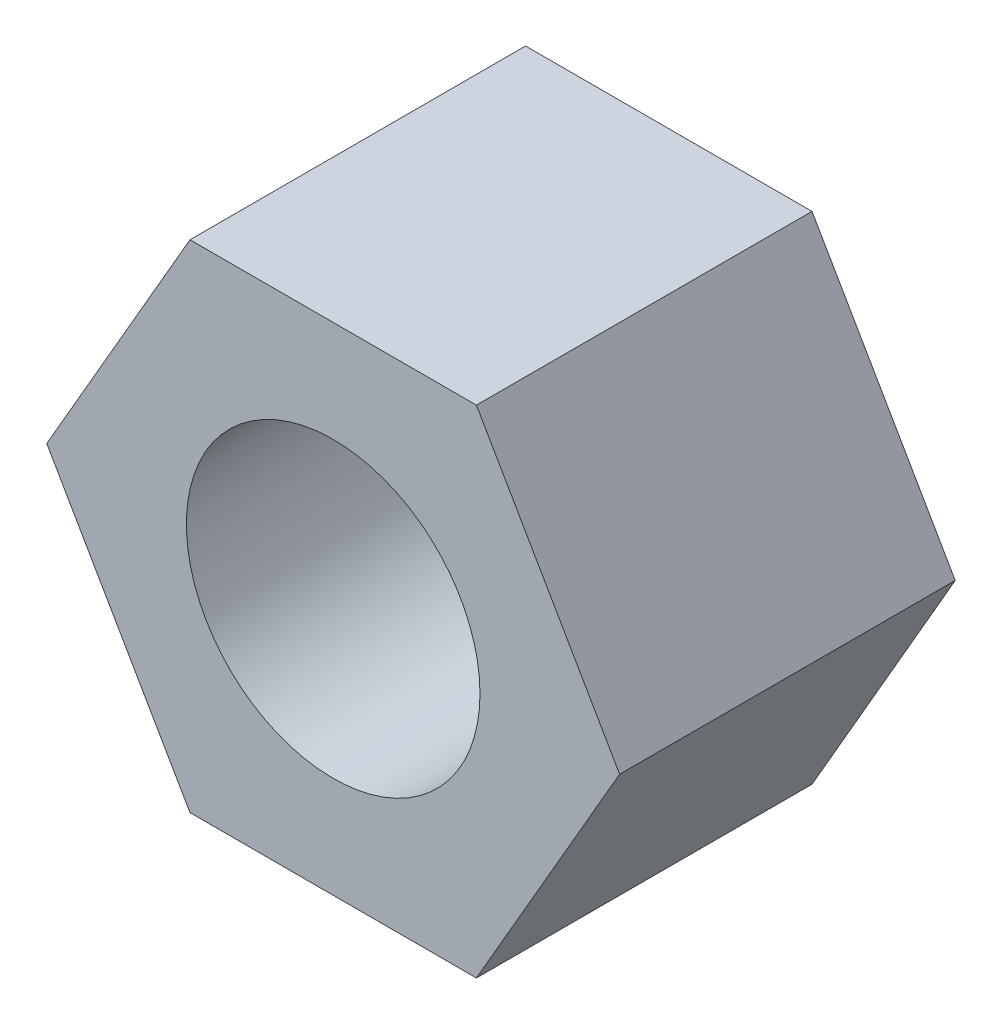
ISO-10303-21;
HEADER;
FILE_DESCRIPTION(('STEP AP214'),'2;1');
FILE_NAME('part.step','',(''),(''),'','','');
FILE_SCHEMA(('AUTOMOTIVE_DESIGN { 1 0 10303 214 1 1 1 1 }'));
ENDSEC;
DATA;
#1=APPLICATION_CONTEXT('core data for automotive mechanical design processes');
#2=APPLICATION_PROTOCOL_DEFINITION('international standard','automotive_design',2000,#1);
#3=PRODUCT_CONTEXT('',#1,'mechanical');
#4=PRODUCT('Part','Part','',(#3));
#5=PRODUCT_RELATED_PRODUCT_CATEGORY('part','',(#4));
#6=PRODUCT_DEFINITION_FORMATION('','',#4);
#7=PRODUCT_DEFINITION_CONTEXT('part definition',#1,'design');
#8=PRODUCT_DEFINITION('design','',#6,#7);
#9=PRODUCT_DEFINITION_SHAPE('','',#8);
#10=(LENGTH_UNIT() NAMED_UNIT(*) SI_UNIT(.MILLI.,.METRE.));
#11=(NAMED_UNIT(*) PLANE_ANGLE_UNIT() SI_UNIT($,.RADIAN.));
#12=(NAMED_UNIT(*) SI_UNIT($,.STERADIAN.) SOLID_ANGLE_UNIT());
#13=UNCERTAINTY_MEASURE_WITH_UNIT(LENGTH_MEASURE(1.E-05),#10,'distance_accuracy_value','');
#14=(GEOMETRIC_REPRESENTATION_CONTEXT(3) GLOBAL_UNCERTAINTY_ASSIGNED_CONTEXT((#13)) GLOBAL_UNIT_ASSIGNED_CONTEXT((#10,
#11,#12)) REPRESENTATION_CONTEXT('',''));
#15=CARTESIAN_POINT('',(0.,0.,0.));
#16=DIRECTION('',(0.,0.,1.));
#17=DIRECTION('',(1.,0.,0.));
#18=AXIS2_PLACEMENT_3D('',#15,#16,#17);
#19=CARTESIAN_POINT('',(0.,0.,11.5));
#20=DIRECTION('',(0.,0.,1.));
#21=DIRECTION('',(1.,0.,0.));
#22=AXIS2_PLACEMENT_3D('',#19,#20,#21);
#23=PLANE('',#22);
#24=DIRECTION('',(0.5,0.866025403784439,0.));
#25=VECTOR('',#24,1.);
#26=CARTESIAN_POINT('',(4.90747728811182,-8.5,11.5));
#27=LINE('',#26,#25);
#28=CARTESIAN_POINT('',(4.90747728811182,-8.5,11.5));
#29=VERTEX_POINT('',#28);
#30=CARTESIAN_POINT('',(9.81495457622364,0.,11.5));
#31=VERTEX_POINT('',#30);
#32=EDGE_CURVE('E133',#29,#31,#27,.T.);
#33=ORIENTED_EDGE('',*,*,#32,.T.);
#34=DIRECTION('',(-0.5,0.866025403784439,0.));
#35=VECTOR('',#34,1.);
#36=CARTESIAN_POINT('',(9.81495457622364,0.,11.5));
#37=LINE('',#36,#35);
#38=CARTESIAN_POINT('',(4.90747728811182,8.5,11.5));
#39=VERTEX_POINT('',#38);
#40=EDGE_CURVE('E91',#31,#39,#37,.T.);
#41=ORIENTED_EDGE('',*,*,#40,.T.);
#42=DIRECTION('',(-1.,0.,0.));
#43=VECTOR('',#42,1.);
#44=CARTESIAN_POINT('',(4.90747728811182,8.5,11.5));
#45=LINE('',#44,#43);
#46=CARTESIAN_POINT('',(-4.90747728811182,8.5,11.5));
#47=VERTEX_POINT('',#46);
#48=EDGE_CURVE('E106',#39,#47,#45,.T.);
#49=ORIENTED_EDGE('',*,*,#48,.T.);
#50=DIRECTION('',(-0.5,-0.866025403784439,0.));
#51=VECTOR('',#50,1.);
#52=CARTESIAN_POINT('',(-4.90747728811182,8.5,11.5));
#53=LINE('',#52,#51);
#54=CARTESIAN_POINT('',(-9.81495457622364,0.,11.5));
#55=VERTEX_POINT('',#54);
#56=EDGE_CURVE('E99',#47,#55,#53,.T.);
#57=ORIENTED_EDGE('',*,*,#56,.T.);
#58=DIRECTION('',(0.5,-0.866025403784439,0.));
#59=VECTOR('',#58,1.);
#60=CARTESIAN_POINT('',(-9.81495457622364,0.,11.5));
#61=LINE('',#60,#59);
#62=CARTESIAN_POINT('',(-4.90747728811182,-8.5,11.5));
#63=VERTEX_POINT('',#62);
#64=EDGE_CURVE('E102',#55,#63,#61,.T.);
#65=ORIENTED_EDGE('',*,*,#64,.T.);
#66=DIRECTION('',(1.,0.,0.));
#67=VECTOR('',#66,1.);
#68=CARTESIAN_POINT('',(-4.90747728811182,-8.5,11.5));
#69=LINE('',#68,#67);
#70=EDGE_CURVE('E57',#63,#29,#69,.T.);
#71=ORIENTED_EDGE('',*,*,#70,.T.);
#72=EDGE_LOOP('',(#33,#41,#49,#57,#65,#71));
#73=FACE_BOUND('',#72,.T.);
#74=CARTESIAN_POINT('',(0.,0.,11.5));
#75=DIRECTION('',(0.,0.,1.));
#76=DIRECTION('',(1.,0.,0.));
#77=AXIS2_PLACEMENT_3D('',#74,#75,#76);
#78=CIRCLE('',#77,5.03);
#79=CARTESIAN_POINT('',(5.03,0.,11.5));
#80=VERTEX_POINT('',#79);
#81=EDGE_CURVE('E126',#80,#80,#78,.T.);
#82=ORIENTED_EDGE('',*,*,#81,.F.);
#83=EDGE_LOOP('',(#82));
#84=FACE_BOUND('',#83,.T.);
#85=ADVANCED_FACE('F39',(#73,#84),#23,.T.);
#86=CARTESIAN_POINT('',(0.,0.,0.));
#87=DIRECTION('',(0.,0.,1.));
#88=DIRECTION('',(1.,0.,0.));
#89=AXIS2_PLACEMENT_3D('',#86,#87,#88);
#90=PLANE('',#89);
#91=DIRECTION('',(0.5,0.866025403784439,0.));
#92=VECTOR('',#91,1.);
#93=CARTESIAN_POINT('',(4.90747728811182,-8.5,0.));
#94=LINE('',#93,#92);
#95=CARTESIAN_POINT('',(4.90747728811182,-8.5,0.));
#96=VERTEX_POINT('',#95);
#97=CARTESIAN_POINT('',(9.81495457622364,0.,0.));
#98=VERTEX_POINT('',#97);
#99=EDGE_CURVE('E123',#96,#98,#94,.T.);
#100=ORIENTED_EDGE('',*,*,#99,.F.);
#101=DIRECTION('',(1.,0.,0.));
#102=VECTOR('',#101,1.);
#103=CARTESIAN_POINT('',(-4.90747728811182,-8.5,0.));
#104=LINE('',#103,#102);
#105=CARTESIAN_POINT('',(-4.90747728811182,-8.5,0.));
#106=VERTEX_POINT('',#105);
#107=EDGE_CURVE('E84',#106,#96,#104,.T.);
#108=ORIENTED_EDGE('',*,*,#107,.F.);
#109=DIRECTION('',(0.5,-0.866025403784439,0.));
#110=VECTOR('',#109,1.);
#111=CARTESIAN_POINT('',(-9.81495457622364,0.,0.));
#112=LINE('',#111,#110);
#113=CARTESIAN_POINT('',(-9.81495457622364,0.,0.));
#114=VERTEX_POINT('',#113);
#115=EDGE_CURVE('E76',#114,#106,#112,.T.);
#116=ORIENTED_EDGE('',*,*,#115,.F.);
#117=DIRECTION('',(-0.5,-0.866025403784439,0.));
#118=VECTOR('',#117,1.);
#119=CARTESIAN_POINT('',(-4.90747728811182,8.5,0.));
#120=LINE('',#119,#118);
#121=CARTESIAN_POINT('',(-4.90747728811182,8.5,0.));
#122=VERTEX_POINT('',#121);
#123=EDGE_CURVE('E111',#122,#114,#120,.T.);
#124=ORIENTED_EDGE('',*,*,#123,.F.);
#125=DIRECTION('',(-1.,0.,0.));
#126=VECTOR('',#125,1.);
#127=CARTESIAN_POINT('',(4.90747728811182,8.5,0.));
#128=LINE('',#127,#126);
#129=CARTESIAN_POINT('',(4.90747728811182,8.5,0.));
#130=VERTEX_POINT('',#129);
#131=EDGE_CURVE('E128',#130,#122,#128,.T.);
#132=ORIENTED_EDGE('',*,*,#131,.F.);
#133=DIRECTION('',(-0.5,0.866025403784439,0.));
#134=VECTOR('',#133,1.);
#135=CARTESIAN_POINT('',(9.81495457622364,0.,0.));
#136=LINE('',#135,#134);
#137=EDGE_CURVE('E130',#98,#130,#136,.T.);
#138=ORIENTED_EDGE('',*,*,#137,.F.);
#139=EDGE_LOOP('',(#100,#108,#116,#124,#132,#138));
#140=FACE_BOUND('',#139,.T.);
#141=CARTESIAN_POINT('',(0.,0.,0.));
#142=DIRECTION('',(0.,0.,1.));
#143=DIRECTION('',(1.,0.,0.));
#144=AXIS2_PLACEMENT_3D('',#141,#142,#143);
#145=CIRCLE('',#144,5.03);
#146=CARTESIAN_POINT('',(5.03,0.,0.));
#147=VERTEX_POINT('',#146);
#148=EDGE_CURVE('E229',#147,#147,#145,.T.);
#149=ORIENTED_EDGE('',*,*,#148,.T.);
#150=EDGE_LOOP('',(#149));
#151=FACE_BOUND('',#150,.T.);
#152=ADVANCED_FACE('F145',(#140,#151),#90,.F.);
#153=CARTESIAN_POINT('',(4.90747728811182,-8.5,11.5));
#154=DIRECTION('',(-0.866025403784439,0.5,0.));
#155=DIRECTION('',(-0.5,-0.866025403784439,0.));
#156=AXIS2_PLACEMENT_3D('',#153,#154,#155);
#157=PLANE('',#156);
#158=ORIENTED_EDGE('',*,*,#99,.T.);
#159=DIRECTION('',(0.,0.,-1.));
#160=VECTOR('',#159,1.);
#161=CARTESIAN_POINT('',(9.81495457622364,0.,11.5));
#162=LINE('',#161,#160);
#163=EDGE_CURVE('E11',#31,#98,#162,.T.);
#164=ORIENTED_EDGE('',*,*,#163,.F.);
#165=ORIENTED_EDGE('',*,*,#32,.F.);
#166=DIRECTION('',(0.,0.,-1.));
#167=VECTOR('',#166,1.);
#168=CARTESIAN_POINT('',(4.90747728811182,-8.5,11.5));
#169=LINE('',#168,#167);
#170=EDGE_CURVE('E118',#29,#96,#169,.T.);
#171=ORIENTED_EDGE('',*,*,#170,.T.);
#172=EDGE_LOOP('',(#158,#164,#165,#171));
#173=FACE_BOUND('',#172,.T.);
#174=ADVANCED_FACE('F41',(#173),#157,.F.);
#175=CARTESIAN_POINT('',(9.81495457622364,0.,11.5));
#176=DIRECTION('',(-0.866025403784439,-0.5,0.));
#177=DIRECTION('',(0.5,-0.866025403784439,0.));
#178=AXIS2_PLACEMENT_3D('',#175,#176,#177);
#179=PLANE('',#178);
#180=ORIENTED_EDGE('',*,*,#137,.T.);
#181=DIRECTION('',(0.,0.,-1.));
#182=VECTOR('',#181,1.);
#183=CARTESIAN_POINT('',(4.90747728811182,8.5,11.5));
#184=LINE('',#183,#182);
#185=EDGE_CURVE('E48',#39,#130,#184,.T.);
#186=ORIENTED_EDGE('',*,*,#185,.F.);
#187=ORIENTED_EDGE('',*,*,#40,.F.);
#188=ORIENTED_EDGE('',*,*,#163,.T.);
#189=EDGE_LOOP('',(#180,#186,#187,#188));
#190=FACE_BOUND('',#189,.T.);
#191=ADVANCED_FACE('F166',(#190),#179,.F.);
#192=CARTESIAN_POINT('',(4.90747728811182,8.5,11.5));
#193=DIRECTION('',(0.,-1.,0.));
#194=DIRECTION('',(0.,0.,-1.));
#195=AXIS2_PLACEMENT_3D('',#192,#193,#194);
#196=PLANE('',#195);
#197=ORIENTED_EDGE('',*,*,#131,.T.);
#198=DIRECTION('',(0.,0.,-1.));
#199=VECTOR('',#198,1.);
#200=CARTESIAN_POINT('',(-4.90747728811182,8.5,11.5));
#201=LINE('',#200,#199);
#202=EDGE_CURVE('E113',#47,#122,#201,.T.);
#203=ORIENTED_EDGE('',*,*,#202,.F.);
#204=ORIENTED_EDGE('',*,*,#48,.F.);
#205=ORIENTED_EDGE('',*,*,#185,.T.);
#206=EDGE_LOOP('',(#197,#203,#204,#205));
#207=FACE_BOUND('',#206,.T.);
#208=ADVANCED_FACE('F143',(#207),#196,.F.);
#209=CARTESIAN_POINT('',(-4.90747728811182,8.5,11.5));
#210=DIRECTION('',(0.866025403784438,-0.5,0.));
#211=DIRECTION('',(0.5,0.866025403784439,0.));
#212=AXIS2_PLACEMENT_3D('',#209,#210,#211);
#213=PLANE('',#212);
#214=ORIENTED_EDGE('',*,*,#123,.T.);
#215=DIRECTION('',(0.,0.,-1.));
#216=VECTOR('',#215,1.);
#217=CARTESIAN_POINT('',(-9.81495457622364,0.,11.5));
#218=LINE('',#217,#216);
#219=EDGE_CURVE('E112',#55,#114,#218,.T.);
#220=ORIENTED_EDGE('',*,*,#219,.F.);
#221=ORIENTED_EDGE('',*,*,#56,.F.);
#222=ORIENTED_EDGE('',*,*,#202,.T.);
#223=EDGE_LOOP('',(#214,#220,#221,#222));
#224=FACE_BOUND('',#223,.T.);
#225=ADVANCED_FACE('F115',(#224),#213,.F.);
#226=CARTESIAN_POINT('',(-9.81495457622364,0.,11.5));
#227=DIRECTION('',(0.866025403784439,0.5,0.));
#228=DIRECTION('',(-0.5,0.866025403784439,0.));
#229=AXIS2_PLACEMENT_3D('',#226,#227,#228);
#230=PLANE('',#229);
#231=ORIENTED_EDGE('',*,*,#115,.T.);
#232=DIRECTION('',(0.,0.,-1.));
#233=VECTOR('',#232,1.);
#234=CARTESIAN_POINT('',(-4.90747728811182,-8.5,11.5));
#235=LINE('',#234,#233);
#236=EDGE_CURVE('E117',#63,#106,#235,.T.);
#237=ORIENTED_EDGE('',*,*,#236,.F.);
#238=ORIENTED_EDGE('',*,*,#64,.F.);
#239=ORIENTED_EDGE('',*,*,#219,.T.);
#240=EDGE_LOOP('',(#231,#237,#238,#239));
#241=FACE_BOUND('',#240,.T.);
#242=ADVANCED_FACE('F119',(#241),#230,.F.);
#243=CARTESIAN_POINT('',(-4.90747728811182,-8.5,11.5));
#244=DIRECTION('',(0.,1.,0.));
#245=DIRECTION('',(-1.,0.,0.));
#246=AXIS2_PLACEMENT_3D('',#243,#244,#245);
#247=PLANE('',#246);
#248=ORIENTED_EDGE('',*,*,#107,.T.);
#249=ORIENTED_EDGE('',*,*,#170,.F.);
#250=ORIENTED_EDGE('',*,*,#70,.F.);
#251=ORIENTED_EDGE('',*,*,#236,.T.);
#252=EDGE_LOOP('',(#248,#249,#250,#251));
#253=FACE_BOUND('',#252,.T.);
#254=ADVANCED_FACE('F149',(#253),#247,.F.);
#255=CARTESIAN_POINT('',(0.,0.,11.5));
#256=DIRECTION('',(0.,0.,-1.));
#257=DIRECTION('',(-1.,0.,0.));
#258=AXIS2_PLACEMENT_3D('',#255,#256,#257);
#259=CYLINDRICAL_SURFACE('',#258,5.03);
#260=ORIENTED_EDGE('',*,*,#81,.T.);
#261=EDGE_LOOP('',(#260));
#262=FACE_BOUND('',#261,.T.);
#263=ORIENTED_EDGE('',*,*,#148,.F.);
#264=EDGE_LOOP('',(#263));
#265=FACE_BOUND('',#264,.T.);
#266=ADVANCED_FACE('F151',(#262,#265),#259,.F.);
#267=CLOSED_SHELL('',(#85,#152,#174,#191,#208,#225,#242,#254,#266));
#268=MANIFOLD_SOLID_BREP('B2',#267);
#269=ADVANCED_BREP_SHAPE_REPRESENTATION('',(#18,#268),#14);
#270=SHAPE_DEFINITION_REPRESENTATION(#9,#269);
ENDSEC;
END-ISO-10303-21;
